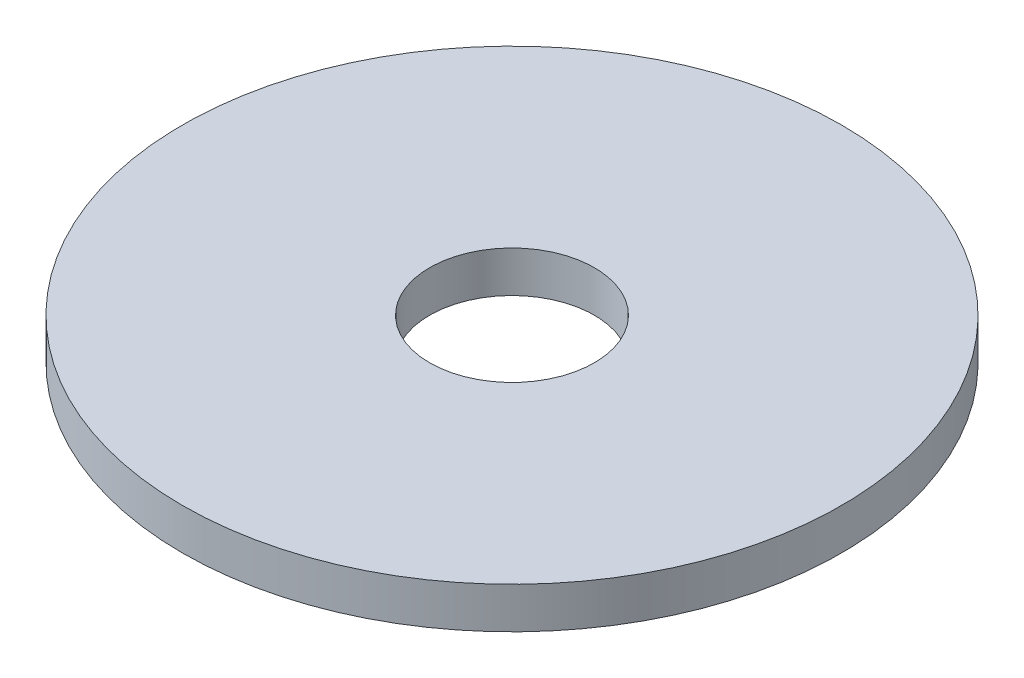
ISO-10303-21;
HEADER;
FILE_DESCRIPTION(('STEP AP214'),'2;1');
FILE_NAME('part.step','',(''),(''),'','','');
FILE_SCHEMA(('AUTOMOTIVE_DESIGN { 1 0 10303 214 1 1 1 1 }'));
ENDSEC;
DATA;
#1=APPLICATION_CONTEXT('core data for automotive mechanical design processes');
#2=APPLICATION_PROTOCOL_DEFINITION('international standard','automotive_design',2000,#1);
#3=PRODUCT_CONTEXT('',#1,'mechanical');
#4=PRODUCT('Part','Part','',(#3));
#5=PRODUCT_RELATED_PRODUCT_CATEGORY('part','',(#4));
#6=PRODUCT_DEFINITION_FORMATION('','',#4);
#7=PRODUCT_DEFINITION_CONTEXT('part definition',#1,'design');
#8=PRODUCT_DEFINITION('design','',#6,#7);
#9=PRODUCT_DEFINITION_SHAPE('','',#8);
#10=(LENGTH_UNIT() NAMED_UNIT(*) SI_UNIT(.MILLI.,.METRE.));
#11=(NAMED_UNIT(*) PLANE_ANGLE_UNIT() SI_UNIT($,.RADIAN.));
#12=(NAMED_UNIT(*) SI_UNIT($,.STERADIAN.) SOLID_ANGLE_UNIT());
#13=UNCERTAINTY_MEASURE_WITH_UNIT(LENGTH_MEASURE(1.E-05),#10,'distance_accuracy_value','');
#14=(GEOMETRIC_REPRESENTATION_CONTEXT(3) GLOBAL_UNCERTAINTY_ASSIGNED_CONTEXT((#13)) GLOBAL_UNIT_ASSIGNED_CONTEXT((#10,
#11,#12)) REPRESENTATION_CONTEXT('',''));
#15=CARTESIAN_POINT('',(0.,0.,0.));
#16=DIRECTION('',(0.,0.,1.));
#17=DIRECTION('',(1.,0.,0.));
#18=AXIS2_PLACEMENT_3D('',#15,#16,#17);
#19=CARTESIAN_POINT('',(0.,1.5875,0.));
#20=DIRECTION('',(0.,-1.,0.));
#21=DIRECTION('',(0.,0.,-1.));
#22=AXIS2_PLACEMENT_3D('',#19,#20,#21);
#23=CYLINDRICAL_SURFACE('',#22,12.7);
#24=CARTESIAN_POINT('',(0.,1.5875,0.));
#25=DIRECTION('',(0.,1.,0.));
#26=DIRECTION('',(0.,0.,1.));
#27=AXIS2_PLACEMENT_3D('',#24,#25,#26);
#28=CIRCLE('',#27,12.7);
#29=CARTESIAN_POINT('',(0.,1.5875,12.7));
#30=VERTEX_POINT('',#29);
#31=EDGE_CURVE('E10',#30,#30,#28,.T.);
#32=ORIENTED_EDGE('',*,*,#31,.F.);
#33=EDGE_LOOP('',(#32));
#34=FACE_BOUND('',#33,.T.);
#35=CARTESIAN_POINT('',(0.,0.,0.));
#36=DIRECTION('',(0.,1.,0.));
#37=DIRECTION('',(0.,0.,1.));
#38=AXIS2_PLACEMENT_3D('',#35,#36,#37);
#39=CIRCLE('',#38,12.7);
#40=CARTESIAN_POINT('',(0.,0.,12.7));
#41=VERTEX_POINT('',#40);
#42=EDGE_CURVE('E36',#41,#41,#39,.T.);
#43=ORIENTED_EDGE('',*,*,#42,.T.);
#44=EDGE_LOOP('',(#43));
#45=FACE_BOUND('',#44,.T.);
#46=ADVANCED_FACE('F33',(#34,#45),#23,.T.);
#47=CARTESIAN_POINT('',(0.,1.5875,0.));
#48=DIRECTION('',(0.,1.,0.));
#49=DIRECTION('',(0.,0.,1.));
#50=AXIS2_PLACEMENT_3D('',#47,#48,#49);
#51=PLANE('',#50);
#52=CARTESIAN_POINT('',(0.,1.5875,0.));
#53=DIRECTION('',(0.,1.,0.));
#54=DIRECTION('',(0.,0.,1.));
#55=AXIS2_PLACEMENT_3D('',#52,#53,#54);
#56=CIRCLE('',#55,3.175);
#57=CARTESIAN_POINT('',(0.,1.5875,3.175));
#58=VERTEX_POINT('',#57);
#59=EDGE_CURVE('E45',#58,#58,#56,.T.);
#60=ORIENTED_EDGE('',*,*,#59,.F.);
#61=EDGE_LOOP('',(#60));
#62=FACE_BOUND('',#61,.T.);
#63=ORIENTED_EDGE('',*,*,#31,.T.);
#64=EDGE_LOOP('',(#63));
#65=FACE_BOUND('',#64,.T.);
#66=ADVANCED_FACE('F60',(#62,#65),#51,.T.);
#67=CARTESIAN_POINT('',(0.,0.,0.));
#68=DIRECTION('',(0.,1.,0.));
#69=DIRECTION('',(0.,0.,1.));
#70=AXIS2_PLACEMENT_3D('',#67,#68,#69);
#71=PLANE('',#70);
#72=CARTESIAN_POINT('',(0.,0.,0.));
#73=DIRECTION('',(0.,1.,0.));
#74=DIRECTION('',(0.,0.,1.));
#75=AXIS2_PLACEMENT_3D('',#72,#73,#74);
#76=CIRCLE('',#75,3.175);
#77=CARTESIAN_POINT('',(0.,0.,3.175));
#78=VERTEX_POINT('',#77);
#79=EDGE_CURVE('E43',#78,#78,#76,.T.);
#80=ORIENTED_EDGE('',*,*,#79,.T.);
#81=EDGE_LOOP('',(#80));
#82=FACE_BOUND('',#81,.T.);
#83=ORIENTED_EDGE('',*,*,#42,.F.);
#84=EDGE_LOOP('',(#83));
#85=FACE_BOUND('',#84,.T.);
#86=ADVANCED_FACE('F51',(#82,#85),#71,.F.);
#87=CARTESIAN_POINT('',(0.,0.,0.));
#88=DIRECTION('',(0.,1.,0.));
#89=DIRECTION('',(0.,0.,1.));
#90=AXIS2_PLACEMENT_3D('',#87,#88,#89);
#91=CYLINDRICAL_SURFACE('',#90,3.175);
#92=ORIENTED_EDGE('',*,*,#79,.F.);
#93=EDGE_LOOP('',(#92));
#94=FACE_BOUND('',#93,.T.);
#95=ORIENTED_EDGE('',*,*,#59,.T.);
#96=EDGE_LOOP('',(#95));
#97=FACE_BOUND('',#96,.T.);
#98=ADVANCED_FACE('F54',(#94,#97),#91,.F.);
#99=CLOSED_SHELL('',(#46,#66,#86,#98));
#100=MANIFOLD_SOLID_BREP('B2',#99);
#101=ADVANCED_BREP_SHAPE_REPRESENTATION('',(#18,#100),#14);
#102=SHAPE_DEFINITION_REPRESENTATION(#9,#101);
ENDSEC;
END-ISO-10303-21;
